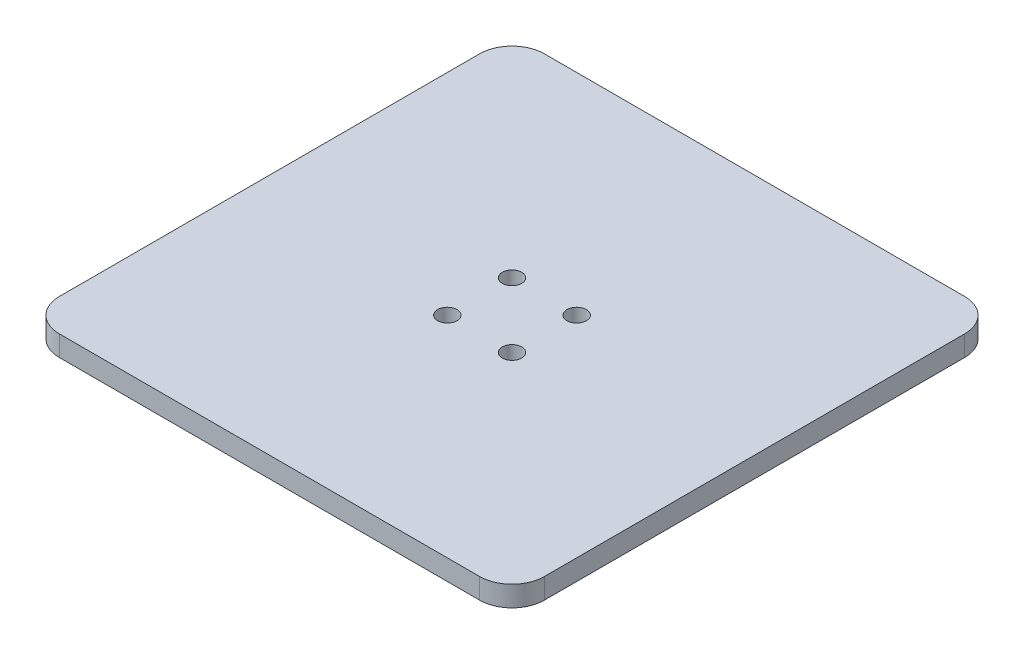
ISO-10303-21;
HEADER;
FILE_DESCRIPTION(('STEP AP214'),'2;1');
FILE_NAME('part.step','',(''),(''),'','','');
FILE_SCHEMA(('AUTOMOTIVE_DESIGN { 1 0 10303 214 1 1 1 1 }'));
ENDSEC;
DATA;
#1=APPLICATION_CONTEXT('core data for automotive mechanical design processes');
#2=APPLICATION_PROTOCOL_DEFINITION('international standard','automotive_design',2000,#1);
#3=PRODUCT_CONTEXT('',#1,'mechanical');
#4=PRODUCT('Part','Part','',(#3));
#5=PRODUCT_RELATED_PRODUCT_CATEGORY('part','',(#4));
#6=PRODUCT_DEFINITION_FORMATION('','',#4);
#7=PRODUCT_DEFINITION_CONTEXT('part definition',#1,'design');
#8=PRODUCT_DEFINITION('design','',#6,#7);
#9=PRODUCT_DEFINITION_SHAPE('','',#8);
#10=(LENGTH_UNIT() NAMED_UNIT(*) SI_UNIT(.MILLI.,.METRE.));
#11=(NAMED_UNIT(*) PLANE_ANGLE_UNIT() SI_UNIT($,.RADIAN.));
#12=(NAMED_UNIT(*) SI_UNIT($,.STERADIAN.) SOLID_ANGLE_UNIT());
#13=UNCERTAINTY_MEASURE_WITH_UNIT(LENGTH_MEASURE(1.E-05),#10,'distance_accuracy_value','');
#14=(GEOMETRIC_REPRESENTATION_CONTEXT(3) GLOBAL_UNCERTAINTY_ASSIGNED_CONTEXT((#13)) GLOBAL_UNIT_ASSIGNED_CONTEXT((#10,
#11,#12)) REPRESENTATION_CONTEXT('',''));
#15=CARTESIAN_POINT('',(0.,0.,0.));
#16=DIRECTION('',(0.,0.,1.));
#17=DIRECTION('',(1.,0.,0.));
#18=AXIS2_PLACEMENT_3D('',#15,#16,#17);
#19=CARTESIAN_POINT('',(0.,0.,0.));
#20=DIRECTION('',(0.,1.,0.));
#21=DIRECTION('',(0.,0.,1.));
#22=AXIS2_PLACEMENT_3D('',#19,#20,#21);
#23=PLANE('',#22);
#24=DIRECTION('',(-1.,0.,0.));
#25=VECTOR('',#24,1.);
#26=CARTESIAN_POINT('',(0.,0.,-150.));
#27=LINE('',#26,#25);
#28=CARTESIAN_POINT('',(-10.,0.,-150.));
#29=VERTEX_POINT('',#28);
#30=CARTESIAN_POINT('',(-140.,0.,-150.));
#31=VERTEX_POINT('',#30);
#32=EDGE_CURVE('E204',#29,#31,#27,.T.);
#33=ORIENTED_EDGE('',*,*,#32,.F.);
#34=CARTESIAN_POINT('',(-10.,0.,-140.));
#35=DIRECTION('',(0.,1.,0.));
#36=DIRECTION('',(0.,0.,1.));
#37=AXIS2_PLACEMENT_3D('',#34,#35,#36);
#38=CIRCLE('',#37,10.);
#39=CARTESIAN_POINT('',(0.,0.,-140.));
#40=VERTEX_POINT('',#39);
#41=EDGE_CURVE('E225',#29,#40,#38,.F.);
#42=ORIENTED_EDGE('',*,*,#41,.T.);
#43=DIRECTION('',(0.,0.,-1.));
#44=VECTOR('',#43,1.);
#45=CARTESIAN_POINT('',(0.,0.,0.));
#46=LINE('',#45,#44);
#47=CARTESIAN_POINT('',(0.,0.,-10.));
#48=VERTEX_POINT('',#47);
#49=EDGE_CURVE('E203',#48,#40,#46,.T.);
#50=ORIENTED_EDGE('',*,*,#49,.F.);
#51=CARTESIAN_POINT('',(-10.,0.,-10.));
#52=DIRECTION('',(0.,1.,0.));
#53=DIRECTION('',(0.,0.,1.));
#54=AXIS2_PLACEMENT_3D('',#51,#52,#53);
#55=CIRCLE('',#54,10.);
#56=CARTESIAN_POINT('',(-10.,0.,0.));
#57=VERTEX_POINT('',#56);
#58=EDGE_CURVE('E216',#48,#57,#55,.F.);
#59=ORIENTED_EDGE('',*,*,#58,.T.);
#60=DIRECTION('',(1.,0.,0.));
#61=VECTOR('',#60,1.);
#62=CARTESIAN_POINT('',(0.,0.,0.));
#63=LINE('',#62,#61);
#64=CARTESIAN_POINT('',(-140.,0.,0.));
#65=VERTEX_POINT('',#64);
#66=EDGE_CURVE('E193',#65,#57,#63,.T.);
#67=ORIENTED_EDGE('',*,*,#66,.F.);
#68=CARTESIAN_POINT('',(-140.,0.,-9.99999999999998));
#69=DIRECTION('',(0.,1.,0.));
#70=DIRECTION('',(0.,0.,1.));
#71=AXIS2_PLACEMENT_3D('',#68,#69,#70);
#72=CIRCLE('',#71,10.);
#73=CARTESIAN_POINT('',(-150.,0.,-9.99999999999998));
#74=VERTEX_POINT('',#73);
#75=EDGE_CURVE('E217',#65,#74,#72,.F.);
#76=ORIENTED_EDGE('',*,*,#75,.T.);
#77=DIRECTION('',(0.,0.,1.));
#78=VECTOR('',#77,1.);
#79=CARTESIAN_POINT('',(-150.,0.,0.));
#80=LINE('',#79,#78);
#81=CARTESIAN_POINT('',(-150.,0.,-140.));
#82=VERTEX_POINT('',#81);
#83=EDGE_CURVE('E210',#82,#74,#80,.T.);
#84=ORIENTED_EDGE('',*,*,#83,.F.);
#85=CARTESIAN_POINT('',(-140.,0.,-140.));
#86=DIRECTION('',(0.,1.,0.));
#87=DIRECTION('',(0.,0.,1.));
#88=AXIS2_PLACEMENT_3D('',#85,#86,#87);
#89=CIRCLE('',#88,10.);
#90=EDGE_CURVE('E219',#82,#31,#89,.F.);
#91=ORIENTED_EDGE('',*,*,#90,.T.);
#92=EDGE_LOOP('',(#33,#42,#50,#59,#67,#76,#84,#91));
#93=FACE_BOUND('',#92,.T.);
#94=DIRECTION('',(0.,0.,-1.));
#95=VECTOR('',#94,1.);
#96=CARTESIAN_POINT('',(-91.1,0.,-60.));
#97=LINE('',#96,#95);
#98=CARTESIAN_POINT('',(-91.1,0.,-60.));
#99=VERTEX_POINT('',#98);
#100=CARTESIAN_POINT('',(-91.1,0.,-90.));
#101=VERTEX_POINT('',#100);
#102=EDGE_CURVE('E64',#99,#101,#97,.T.);
#103=ORIENTED_EDGE('',*,*,#102,.F.);
#104=DIRECTION('',(-1.,0.,0.));
#105=VECTOR('',#104,1.);
#106=CARTESIAN_POINT('',(-91.1,0.,-60.));
#107=LINE('',#106,#105);
#108=CARTESIAN_POINT('',(-58.9,0.,-60.));
#109=VERTEX_POINT('',#108);
#110=EDGE_CURVE('E68',#109,#99,#107,.T.);
#111=ORIENTED_EDGE('',*,*,#110,.F.);
#112=DIRECTION('',(0.,0.,1.));
#113=VECTOR('',#112,1.);
#114=CARTESIAN_POINT('',(-58.9,0.,-60.));
#115=LINE('',#114,#113);
#116=CARTESIAN_POINT('',(-58.9,0.,-90.));
#117=VERTEX_POINT('',#116);
#118=EDGE_CURVE('E521',#117,#109,#115,.T.);
#119=ORIENTED_EDGE('',*,*,#118,.F.);
#120=DIRECTION('',(1.,0.,0.));
#121=VECTOR('',#120,1.);
#122=CARTESIAN_POINT('',(-91.1,0.,-90.));
#123=LINE('',#122,#121);
#124=EDGE_CURVE('E533',#101,#117,#123,.T.);
#125=ORIENTED_EDGE('',*,*,#124,.F.);
#126=EDGE_LOOP('',(#103,#111,#119,#125));
#127=FACE_BOUND('',#126,.T.);
#128=ADVANCED_FACE('F44',(#93,#127),#23,.F.);
#129=CARTESIAN_POINT('',(-85.,6.35,-85.));
#130=DIRECTION('',(0.,-1.,0.));
#131=DIRECTION('',(0.,0.,-1.));
#132=AXIS2_PLACEMENT_3D('',#129,#130,#131);
#133=CYLINDRICAL_SURFACE('',#132,1.25000000000001);
#134=CARTESIAN_POINT('',(-85.,2.05,-85.));
#135=DIRECTION('',(0.,1.,0.));
#136=DIRECTION('',(0.,0.,1.));
#137=AXIS2_PLACEMENT_3D('',#134,#135,#136);
#138=CIRCLE('',#137,1.25000000000001);
#139=CARTESIAN_POINT('',(-85.,2.05,-83.75));
#140=VERTEX_POINT('',#139);
#141=EDGE_CURVE('E47',#140,#140,#138,.T.);
#142=ORIENTED_EDGE('',*,*,#141,.T.);
#143=EDGE_LOOP('',(#142));
#144=FACE_BOUND('',#143,.T.);
#145=CARTESIAN_POINT('',(-85.,-9.,-85.));
#146=DIRECTION('',(0.,-1.,0.));
#147=DIRECTION('',(0.,0.,-1.));
#148=AXIS2_PLACEMENT_3D('',#145,#146,#147);
#149=CIRCLE('',#148,1.25000000000002);
#150=CARTESIAN_POINT('',(-85.,-9.,-86.25));
#151=VERTEX_POINT('',#150);
#152=EDGE_CURVE('E538',#151,#151,#149,.T.);
#153=ORIENTED_EDGE('',*,*,#152,.T.);
#154=EDGE_LOOP('',(#153));
#155=FACE_BOUND('',#154,.T.);
#156=ADVANCED_FACE('F255',(#144,#155),#133,.F.);
#157=CARTESIAN_POINT('',(-65.,6.35,-85.));
#158=DIRECTION('',(0.,-1.,0.));
#159=DIRECTION('',(0.,0.,-1.));
#160=AXIS2_PLACEMENT_3D('',#157,#158,#159);
#161=CYLINDRICAL_SURFACE('',#160,1.25000000000001);
#162=CARTESIAN_POINT('',(-65.,2.05,-85.));
#163=DIRECTION('',(0.,1.,0.));
#164=DIRECTION('',(0.,0.,1.));
#165=AXIS2_PLACEMENT_3D('',#162,#163,#164);
#166=CIRCLE('',#165,1.25000000000001);
#167=CARTESIAN_POINT('',(-65.,2.05,-83.75));
#168=VERTEX_POINT('',#167);
#169=EDGE_CURVE('E249',#168,#168,#166,.T.);
#170=ORIENTED_EDGE('',*,*,#169,.T.);
#171=EDGE_LOOP('',(#170));
#172=FACE_BOUND('',#171,.T.);
#173=CARTESIAN_POINT('',(-65.,-9.,-85.));
#174=DIRECTION('',(0.,-1.,0.));
#175=DIRECTION('',(0.,0.,-1.));
#176=AXIS2_PLACEMENT_3D('',#173,#174,#175);
#177=CIRCLE('',#176,1.25000000000001);
#178=CARTESIAN_POINT('',(-65.,-9.,-86.25));
#179=VERTEX_POINT('',#178);
#180=EDGE_CURVE('E541',#179,#179,#177,.T.);
#181=ORIENTED_EDGE('',*,*,#180,.T.);
#182=EDGE_LOOP('',(#181));
#183=FACE_BOUND('',#182,.T.);
#184=ADVANCED_FACE('F322',(#172,#183),#161,.F.);
#185=CARTESIAN_POINT('',(-85.,6.35,-65.));
#186=DIRECTION('',(0.,-1.,0.));
#187=DIRECTION('',(0.,0.,-1.));
#188=AXIS2_PLACEMENT_3D('',#185,#186,#187);
#189=CYLINDRICAL_SURFACE('',#188,1.25000000000001);
#190=CARTESIAN_POINT('',(-85.,2.05,-65.));
#191=DIRECTION('',(0.,1.,0.));
#192=DIRECTION('',(0.,0.,1.));
#193=AXIS2_PLACEMENT_3D('',#190,#191,#192);
#194=CIRCLE('',#193,1.25000000000001);
#195=CARTESIAN_POINT('',(-85.,2.05,-63.75));
#196=VERTEX_POINT('',#195);
#197=EDGE_CURVE('E241',#196,#196,#194,.T.);
#198=ORIENTED_EDGE('',*,*,#197,.T.);
#199=EDGE_LOOP('',(#198));
#200=FACE_BOUND('',#199,.T.);
#201=CARTESIAN_POINT('',(-85.,-9.,-65.));
#202=DIRECTION('',(0.,-1.,0.));
#203=DIRECTION('',(0.,0.,-1.));
#204=AXIS2_PLACEMENT_3D('',#201,#202,#203);
#205=CIRCLE('',#204,1.25000000000001);
#206=CARTESIAN_POINT('',(-85.,-9.,-66.25));
#207=VERTEX_POINT('',#206);
#208=EDGE_CURVE('E531',#207,#207,#205,.T.);
#209=ORIENTED_EDGE('',*,*,#208,.T.);
#210=EDGE_LOOP('',(#209));
#211=FACE_BOUND('',#210,.T.);
#212=ADVANCED_FACE('F451',(#200,#211),#189,.F.);
#213=CARTESIAN_POINT('',(-65.,6.35,-65.));
#214=DIRECTION('',(0.,-1.,0.));
#215=DIRECTION('',(0.,0.,-1.));
#216=AXIS2_PLACEMENT_3D('',#213,#214,#215);
#217=CYLINDRICAL_SURFACE('',#216,1.25000000000001);
#218=CARTESIAN_POINT('',(-65.,2.05,-65.));
#219=DIRECTION('',(0.,1.,0.));
#220=DIRECTION('',(0.,0.,1.));
#221=AXIS2_PLACEMENT_3D('',#218,#219,#220);
#222=CIRCLE('',#221,1.25000000000001);
#223=CARTESIAN_POINT('',(-65.,2.05,-63.75));
#224=VERTEX_POINT('',#223);
#225=EDGE_CURVE('E184',#224,#224,#222,.T.);
#226=ORIENTED_EDGE('',*,*,#225,.T.);
#227=EDGE_LOOP('',(#226));
#228=FACE_BOUND('',#227,.T.);
#229=CARTESIAN_POINT('',(-65.,-9.,-65.));
#230=DIRECTION('',(0.,-1.,0.));
#231=DIRECTION('',(0.,0.,-1.));
#232=AXIS2_PLACEMENT_3D('',#229,#230,#231);
#233=CIRCLE('',#232,1.25000000000001);
#234=CARTESIAN_POINT('',(-65.,-9.,-66.25));
#235=VERTEX_POINT('',#234);
#236=EDGE_CURVE('E542',#235,#235,#233,.T.);
#237=ORIENTED_EDGE('',*,*,#236,.T.);
#238=EDGE_LOOP('',(#237));
#239=FACE_BOUND('',#238,.T.);
#240=ADVANCED_FACE('F273',(#228,#239),#217,.F.);
#241=CARTESIAN_POINT('',(0.,6.35,0.));
#242=DIRECTION('',(0.,1.,0.));
#243=DIRECTION('',(0.,0.,1.));
#244=AXIS2_PLACEMENT_3D('',#241,#242,#243);
#245=PLANE('',#244);
#246=CARTESIAN_POINT('',(-65.,6.35,-85.));
#247=DIRECTION('',(0.,1.,0.));
#248=DIRECTION('',(0.,0.,1.));
#249=AXIS2_PLACEMENT_3D('',#246,#247,#248);
#250=CIRCLE('',#249,3.);
#251=CARTESIAN_POINT('',(-65.,6.35,-82.));
#252=VERTEX_POINT('',#251);
#253=EDGE_CURVE('E166',#252,#252,#250,.T.);
#254=ORIENTED_EDGE('',*,*,#253,.F.);
#255=EDGE_LOOP('',(#254));
#256=FACE_BOUND('',#255,.T.);
#257=CARTESIAN_POINT('',(-85.,6.35,-65.));
#258=DIRECTION('',(0.,1.,0.));
#259=DIRECTION('',(0.,0.,1.));
#260=AXIS2_PLACEMENT_3D('',#257,#258,#259);
#261=CIRCLE('',#260,3.00000000000001);
#262=CARTESIAN_POINT('',(-85.,6.35,-62.));
#263=VERTEX_POINT('',#262);
#264=EDGE_CURVE('E178',#263,#263,#261,.T.);
#265=ORIENTED_EDGE('',*,*,#264,.F.);
#266=EDGE_LOOP('',(#265));
#267=FACE_BOUND('',#266,.T.);
#268=CARTESIAN_POINT('',(-65.,6.35,-65.));
#269=DIRECTION('',(0.,1.,0.));
#270=DIRECTION('',(0.,0.,1.));
#271=AXIS2_PLACEMENT_3D('',#268,#269,#270);
#272=CIRCLE('',#271,3.);
#273=CARTESIAN_POINT('',(-65.,6.35,-62.));
#274=VERTEX_POINT('',#273);
#275=EDGE_CURVE('E159',#274,#274,#272,.T.);
#276=ORIENTED_EDGE('',*,*,#275,.F.);
#277=EDGE_LOOP('',(#276));
#278=FACE_BOUND('',#277,.T.);
#279=CARTESIAN_POINT('',(-85.,6.35,-85.));
#280=DIRECTION('',(0.,1.,0.));
#281=DIRECTION('',(0.,0.,1.));
#282=AXIS2_PLACEMENT_3D('',#279,#280,#281);
#283=CIRCLE('',#282,3.00000000000001);
#284=CARTESIAN_POINT('',(-85.,6.35,-82.));
#285=VERTEX_POINT('',#284);
#286=EDGE_CURVE('E174',#285,#285,#283,.T.);
#287=ORIENTED_EDGE('',*,*,#286,.F.);
#288=EDGE_LOOP('',(#287));
#289=FACE_BOUND('',#288,.T.);
#290=DIRECTION('',(0.,0.,-1.));
#291=VECTOR('',#290,1.);
#292=CARTESIAN_POINT('',(0.,6.35,0.));
#293=LINE('',#292,#291);
#294=CARTESIAN_POINT('',(0.,6.35,-10.));
#295=VERTEX_POINT('',#294);
#296=CARTESIAN_POINT('',(0.,6.35,-140.));
#297=VERTEX_POINT('',#296);
#298=EDGE_CURVE('E189',#295,#297,#293,.T.);
#299=ORIENTED_EDGE('',*,*,#298,.T.);
#300=CARTESIAN_POINT('',(-10.,6.35,-140.));
#301=DIRECTION('',(0.,1.,0.));
#302=DIRECTION('',(0.,0.,1.));
#303=AXIS2_PLACEMENT_3D('',#300,#301,#302);
#304=CIRCLE('',#303,10.);
#305=CARTESIAN_POINT('',(-10.,6.35,-150.));
#306=VERTEX_POINT('',#305);
#307=EDGE_CURVE('E231',#297,#306,#304,.T.);
#308=ORIENTED_EDGE('',*,*,#307,.T.);
#309=DIRECTION('',(-1.,0.,0.));
#310=VECTOR('',#309,1.);
#311=CARTESIAN_POINT('',(0.,6.35,-150.));
#312=LINE('',#311,#310);
#313=CARTESIAN_POINT('',(-140.,6.35,-150.));
#314=VERTEX_POINT('',#313);
#315=EDGE_CURVE('E186',#306,#314,#312,.T.);
#316=ORIENTED_EDGE('',*,*,#315,.T.);
#317=CARTESIAN_POINT('',(-140.,6.35,-140.));
#318=DIRECTION('',(0.,1.,0.));
#319=DIRECTION('',(0.,0.,1.));
#320=AXIS2_PLACEMENT_3D('',#317,#318,#319);
#321=CIRCLE('',#320,10.);
#322=CARTESIAN_POINT('',(-150.,6.35,-140.));
#323=VERTEX_POINT('',#322);
#324=EDGE_CURVE('E232',#314,#323,#321,.T.);
#325=ORIENTED_EDGE('',*,*,#324,.T.);
#326=DIRECTION('',(0.,0.,1.));
#327=VECTOR('',#326,1.);
#328=CARTESIAN_POINT('',(-150.,6.35,0.));
#329=LINE('',#328,#327);
#330=CARTESIAN_POINT('',(-150.,6.35,-9.99999999999998));
#331=VERTEX_POINT('',#330);
#332=EDGE_CURVE('E195',#323,#331,#329,.T.);
#333=ORIENTED_EDGE('',*,*,#332,.T.);
#334=CARTESIAN_POINT('',(-140.,6.35,-9.99999999999998));
#335=DIRECTION('',(0.,1.,0.));
#336=DIRECTION('',(0.,0.,1.));
#337=AXIS2_PLACEMENT_3D('',#334,#335,#336);
#338=CIRCLE('',#337,10.);
#339=CARTESIAN_POINT('',(-140.,6.35,0.));
#340=VERTEX_POINT('',#339);
#341=EDGE_CURVE('E233',#331,#340,#338,.T.);
#342=ORIENTED_EDGE('',*,*,#341,.T.);
#343=DIRECTION('',(1.,0.,0.));
#344=VECTOR('',#343,1.);
#345=CARTESIAN_POINT('',(0.,6.35,0.));
#346=LINE('',#345,#344);
#347=CARTESIAN_POINT('',(-10.,6.35,0.));
#348=VERTEX_POINT('',#347);
#349=EDGE_CURVE('E197',#340,#348,#346,.T.);
#350=ORIENTED_EDGE('',*,*,#349,.T.);
#351=CARTESIAN_POINT('',(-10.,6.35,-10.));
#352=DIRECTION('',(0.,1.,0.));
#353=DIRECTION('',(0.,0.,1.));
#354=AXIS2_PLACEMENT_3D('',#351,#352,#353);
#355=CIRCLE('',#354,10.);
#356=EDGE_CURVE('E230',#348,#295,#355,.T.);
#357=ORIENTED_EDGE('',*,*,#356,.T.);
#358=EDGE_LOOP('',(#299,#308,#316,#325,#333,#342,#350,#357));
#359=FACE_BOUND('',#358,.T.);
#360=ADVANCED_FACE('F269',(#256,#267,#278,#289,#359),#245,.T.);
#361=CARTESIAN_POINT('',(0.,6.35,0.));
#362=DIRECTION('',(-1.,0.,0.));
#363=DIRECTION('',(0.,0.,1.));
#364=AXIS2_PLACEMENT_3D('',#361,#362,#363);
#365=PLANE('',#364);
#366=ORIENTED_EDGE('',*,*,#49,.T.);
#367=DIRECTION('',(0.,-1.,0.));
#368=VECTOR('',#367,1.);
#369=CARTESIAN_POINT('',(0.,6.35,-140.));
#370=LINE('',#369,#368);
#371=EDGE_CURVE('E229',#40,#297,#370,.F.);
#372=ORIENTED_EDGE('',*,*,#371,.T.);
#373=ORIENTED_EDGE('',*,*,#298,.F.);
#374=DIRECTION('',(0.,-1.,0.));
#375=VECTOR('',#374,1.);
#376=CARTESIAN_POINT('',(0.,6.35,-10.));
#377=LINE('',#376,#375);
#378=EDGE_CURVE('E221',#295,#48,#377,.T.);
#379=ORIENTED_EDGE('',*,*,#378,.T.);
#380=EDGE_LOOP('',(#366,#372,#373,#379));
#381=FACE_BOUND('',#380,.T.);
#382=ADVANCED_FACE('F272',(#381),#365,.F.);
#383=CARTESIAN_POINT('',(0.,6.35,-150.));
#384=DIRECTION('',(0.,0.,1.));
#385=DIRECTION('',(1.,0.,0.));
#386=AXIS2_PLACEMENT_3D('',#383,#384,#385);
#387=PLANE('',#386);
#388=ORIENTED_EDGE('',*,*,#315,.F.);
#389=DIRECTION('',(0.,-1.,0.));
#390=VECTOR('',#389,1.);
#391=CARTESIAN_POINT('',(-10.,6.35,-150.));
#392=LINE('',#391,#390);
#393=EDGE_CURVE('E213',#306,#29,#392,.T.);
#394=ORIENTED_EDGE('',*,*,#393,.T.);
#395=ORIENTED_EDGE('',*,*,#32,.T.);
#396=DIRECTION('',(0.,-1.,0.));
#397=VECTOR('',#396,1.);
#398=CARTESIAN_POINT('',(-140.,6.35,-150.));
#399=LINE('',#398,#397);
#400=EDGE_CURVE('E199',#31,#314,#399,.F.);
#401=ORIENTED_EDGE('',*,*,#400,.T.);
#402=EDGE_LOOP('',(#388,#394,#395,#401));
#403=FACE_BOUND('',#402,.T.);
#404=ADVANCED_FACE('F290',(#403),#387,.F.);
#405=CARTESIAN_POINT('',(-150.,6.35,0.));
#406=DIRECTION('',(1.,0.,0.));
#407=DIRECTION('',(0.,0.,-1.));
#408=AXIS2_PLACEMENT_3D('',#405,#406,#407);
#409=PLANE('',#408);
#410=ORIENTED_EDGE('',*,*,#332,.F.);
#411=DIRECTION('',(0.,-1.,0.));
#412=VECTOR('',#411,1.);
#413=CARTESIAN_POINT('',(-150.,6.35,-140.));
#414=LINE('',#413,#412);
#415=EDGE_CURVE('E239',#323,#82,#414,.T.);
#416=ORIENTED_EDGE('',*,*,#415,.T.);
#417=ORIENTED_EDGE('',*,*,#83,.T.);
#418=DIRECTION('',(0.,-1.,0.));
#419=VECTOR('',#418,1.);
#420=CARTESIAN_POINT('',(-150.,6.35,-9.99999999999998));
#421=LINE('',#420,#419);
#422=EDGE_CURVE('E240',#74,#331,#421,.F.);
#423=ORIENTED_EDGE('',*,*,#422,.T.);
#424=EDGE_LOOP('',(#410,#416,#417,#423));
#425=FACE_BOUND('',#424,.T.);
#426=ADVANCED_FACE('F296',(#425),#409,.F.);
#427=CARTESIAN_POINT('',(0.,6.35,0.));
#428=DIRECTION('',(0.,0.,-1.));
#429=DIRECTION('',(-1.,0.,0.));
#430=AXIS2_PLACEMENT_3D('',#427,#428,#429);
#431=PLANE('',#430);
#432=ORIENTED_EDGE('',*,*,#349,.F.);
#433=DIRECTION('',(0.,-1.,0.));
#434=VECTOR('',#433,1.);
#435=CARTESIAN_POINT('',(-140.,6.35,0.));
#436=LINE('',#435,#434);
#437=EDGE_CURVE('E11',#340,#65,#436,.T.);
#438=ORIENTED_EDGE('',*,*,#437,.T.);
#439=ORIENTED_EDGE('',*,*,#66,.T.);
#440=DIRECTION('',(0.,-1.,0.));
#441=VECTOR('',#440,1.);
#442=CARTESIAN_POINT('',(-10.,6.35,0.));
#443=LINE('',#442,#441);
#444=EDGE_CURVE('E53',#57,#348,#443,.F.);
#445=ORIENTED_EDGE('',*,*,#444,.T.);
#446=EDGE_LOOP('',(#432,#438,#439,#445));
#447=FACE_BOUND('',#446,.T.);
#448=ADVANCED_FACE('F310',(#447),#431,.F.);
#449=CARTESIAN_POINT('',(-10.,6.35,-140.));
#450=DIRECTION('',(0.,-1.,0.));
#451=DIRECTION('',(0.,0.,-1.));
#452=AXIS2_PLACEMENT_3D('',#449,#450,#451);
#453=CYLINDRICAL_SURFACE('',#452,10.);
#454=ORIENTED_EDGE('',*,*,#307,.F.);
#455=ORIENTED_EDGE('',*,*,#371,.F.);
#456=ORIENTED_EDGE('',*,*,#41,.F.);
#457=ORIENTED_EDGE('',*,*,#393,.F.);
#458=EDGE_LOOP('',(#454,#455,#456,#457));
#459=FACE_BOUND('',#458,.T.);
#460=ADVANCED_FACE('F288',(#459),#453,.T.);
#461=CARTESIAN_POINT('',(-140.,6.35,-140.));
#462=DIRECTION('',(0.,-1.,0.));
#463=DIRECTION('',(0.,0.,-1.));
#464=AXIS2_PLACEMENT_3D('',#461,#462,#463);
#465=CYLINDRICAL_SURFACE('',#464,10.);
#466=ORIENTED_EDGE('',*,*,#324,.F.);
#467=ORIENTED_EDGE('',*,*,#400,.F.);
#468=ORIENTED_EDGE('',*,*,#90,.F.);
#469=ORIENTED_EDGE('',*,*,#415,.F.);
#470=EDGE_LOOP('',(#466,#467,#468,#469));
#471=FACE_BOUND('',#470,.T.);
#472=ADVANCED_FACE('F299',(#471),#465,.T.);
#473=CARTESIAN_POINT('',(-140.,6.35,-9.99999999999998));
#474=DIRECTION('',(0.,-1.,0.));
#475=DIRECTION('',(0.,0.,-1.));
#476=AXIS2_PLACEMENT_3D('',#473,#474,#475);
#477=CYLINDRICAL_SURFACE('',#476,10.);
#478=ORIENTED_EDGE('',*,*,#341,.F.);
#479=ORIENTED_EDGE('',*,*,#422,.F.);
#480=ORIENTED_EDGE('',*,*,#75,.F.);
#481=ORIENTED_EDGE('',*,*,#437,.F.);
#482=EDGE_LOOP('',(#478,#479,#480,#481));
#483=FACE_BOUND('',#482,.T.);
#484=ADVANCED_FACE('F308',(#483),#477,.T.);
#485=CARTESIAN_POINT('',(-10.,6.35,-10.));
#486=DIRECTION('',(0.,-1.,0.));
#487=DIRECTION('',(0.,0.,-1.));
#488=AXIS2_PLACEMENT_3D('',#485,#486,#487);
#489=CYLINDRICAL_SURFACE('',#488,10.);
#490=ORIENTED_EDGE('',*,*,#356,.F.);
#491=ORIENTED_EDGE('',*,*,#444,.F.);
#492=ORIENTED_EDGE('',*,*,#58,.F.);
#493=ORIENTED_EDGE('',*,*,#378,.F.);
#494=EDGE_LOOP('',(#490,#491,#492,#493));
#495=FACE_BOUND('',#494,.T.);
#496=ADVANCED_FACE('F50',(#495),#489,.T.);
#497=CARTESIAN_POINT('',(-65.,2.05,-65.));
#498=DIRECTION('',(0.,1.,0.));
#499=DIRECTION('',(0.,0.,1.));
#500=AXIS2_PLACEMENT_3D('',#497,#498,#499);
#501=CYLINDRICAL_SURFACE('',#500,3.);
#502=CARTESIAN_POINT('',(-65.,2.05,-65.));
#503=DIRECTION('',(0.,1.,0.));
#504=DIRECTION('',(0.,0.,1.));
#505=AXIS2_PLACEMENT_3D('',#502,#503,#504);
#506=CIRCLE('',#505,3.);
#507=CARTESIAN_POINT('',(-65.,2.05,-62.));
#508=VERTEX_POINT('',#507);
#509=EDGE_CURVE('E160',#508,#508,#506,.T.);
#510=CARTESIAN_POINT('',(-65.,2.05,-62.));
#511=CARTESIAN_POINT('',(-65.,2.09479166666667,-62.));
#512=CARTESIAN_POINT('',(-65.,2.13958333333333,-62.));
#513=CARTESIAN_POINT('',(-65.,2.22916666666667,-62.));
#514=CARTESIAN_POINT('',(-65.,2.27395833333333,-62.));
#515=CARTESIAN_POINT('',(-65.,2.36354166666667,-62.));
#516=CARTESIAN_POINT('',(-65.,2.40833333333333,-62.));
#517=CARTESIAN_POINT('',(-65.,2.49791666666667,-62.));
#518=CARTESIAN_POINT('',(-65.,2.54270833333333,-62.));
#519=CARTESIAN_POINT('',(-65.,2.63229166666667,-62.));
#520=CARTESIAN_POINT('',(-65.,2.67708333333333,-62.));
#521=CARTESIAN_POINT('',(-65.,2.76666666666667,-62.));
#522=CARTESIAN_POINT('',(-65.,2.81145833333333,-62.));
#523=CARTESIAN_POINT('',(-65.,2.90104166666667,-62.));
#524=CARTESIAN_POINT('',(-65.,2.94583333333333,-62.));
#525=CARTESIAN_POINT('',(-65.,3.03541666666667,-62.));
#526=CARTESIAN_POINT('',(-65.,3.08020833333333,-62.));
#527=CARTESIAN_POINT('',(-65.,3.16979166666667,-62.));
#528=CARTESIAN_POINT('',(-65.,3.21458333333333,-62.));
#529=CARTESIAN_POINT('',(-65.,3.30416666666667,-62.));
#530=CARTESIAN_POINT('',(-65.,3.34895833333333,-62.));
#531=CARTESIAN_POINT('',(-65.,3.43854166666667,-62.));
#532=CARTESIAN_POINT('',(-65.,3.48333333333333,-62.));
#533=CARTESIAN_POINT('',(-65.,3.57291666666667,-62.));
#534=CARTESIAN_POINT('',(-65.,3.61770833333333,-62.));
#535=CARTESIAN_POINT('',(-65.,3.70729166666667,-62.));
#536=CARTESIAN_POINT('',(-65.,3.75208333333333,-62.));
#537=CARTESIAN_POINT('',(-65.,3.84166666666667,-62.));
#538=CARTESIAN_POINT('',(-65.,3.88645833333333,-62.));
#539=CARTESIAN_POINT('',(-65.,3.97604166666667,-62.));
#540=CARTESIAN_POINT('',(-65.,4.02083333333333,-62.));
#541=CARTESIAN_POINT('',(-65.,4.11041666666667,-62.));
#542=CARTESIAN_POINT('',(-65.,4.15520833333333,-62.));
#543=CARTESIAN_POINT('',(-65.,4.24479166666667,-62.));
#544=CARTESIAN_POINT('',(-65.,4.28958333333333,-62.));
#545=CARTESIAN_POINT('',(-65.,4.37916666666667,-62.));
#546=CARTESIAN_POINT('',(-65.,4.42395833333333,-62.));
#547=CARTESIAN_POINT('',(-65.,4.51354166666667,-62.));
#548=CARTESIAN_POINT('',(-65.,4.55833333333333,-62.));
#549=CARTESIAN_POINT('',(-65.,4.64791666666667,-62.));
#550=CARTESIAN_POINT('',(-65.,4.69270833333333,-62.));
#551=CARTESIAN_POINT('',(-65.,4.78229166666667,-62.));
#552=CARTESIAN_POINT('',(-65.,4.82708333333333,-62.));
#553=CARTESIAN_POINT('',(-65.,4.91666666666667,-62.));
#554=CARTESIAN_POINT('',(-65.,4.96145833333333,-62.));
#555=CARTESIAN_POINT('',(-65.,5.05104166666667,-62.));
#556=CARTESIAN_POINT('',(-65.,5.09583333333333,-62.));
#557=CARTESIAN_POINT('',(-65.,5.18541666666667,-62.));
#558=CARTESIAN_POINT('',(-65.,5.23020833333333,-62.));
#559=CARTESIAN_POINT('',(-65.,5.31979166666667,-62.));
#560=CARTESIAN_POINT('',(-65.,5.36458333333333,-62.));
#561=CARTESIAN_POINT('',(-65.,5.45416666666667,-62.));
#562=CARTESIAN_POINT('',(-65.,5.49895833333333,-62.));
#563=CARTESIAN_POINT('',(-65.,5.58854166666667,-62.));
#564=CARTESIAN_POINT('',(-65.,5.63333333333333,-62.));
#565=CARTESIAN_POINT('',(-65.,5.72291666666667,-62.));
#566=CARTESIAN_POINT('',(-65.,5.76770833333333,-62.));
#567=CARTESIAN_POINT('',(-65.,5.85729166666667,-62.));
#568=CARTESIAN_POINT('',(-65.,5.90208333333333,-62.));
#569=CARTESIAN_POINT('',(-65.,5.99166666666667,-62.));
#570=CARTESIAN_POINT('',(-65.,6.03645833333333,-62.));
#571=CARTESIAN_POINT('',(-65.,6.12604166666667,-62.));
#572=CARTESIAN_POINT('',(-65.,6.17083333333333,-62.));
#573=CARTESIAN_POINT('',(-65.,6.26041666666667,-62.));
#574=CARTESIAN_POINT('',(-65.,6.30520833333333,-62.));
#575=CARTESIAN_POINT('',(-65.,6.35,-62.));
#576=B_SPLINE_CURVE_WITH_KNOTS('',3,(#510,#511,#512,#513,#514,#515,#516,#517,#518,#519,#520,
#521,#522,#523,#524,#525,#526,#527,#528,#529,#530,#531,#532,#533,#534,#535,#536,#537,#538,#539,
#540,#541,#542,#543,#544,#545,#546,#547,#548,#549,#550,#551,#552,#553,#554,#555,#556,#557,#558,
#559,#560,#561,#562,#563,#564,#565,#566,#567,#568,#569,#570,#571,#572,#573,#574,#575),
.UNSPECIFIED.,.F.,.F.,(4,2,2,2,2,2,2,2,2,2,2,2,2,2,2,2,2,2,2,2,2,2,2,2,2,2,2,2,2,2,2,2,4),(0.,
0.134375,0.26875,0.403125,0.5375,0.671875,0.80625,0.940625,1.075,1.209375,1.34375,1.478125,
1.6125,1.746875,1.88125,2.015625,2.15,2.284375,2.41875,2.553125,2.6875,2.821875,2.95625,
3.090625,3.225,3.359375,3.49375,3.628125,3.7625,3.896875,4.03125,4.165625,4.3),.UNSPECIFIED.);
#577=EDGE_CURVE('BSEAM365',#508,#274,#576,.T.);
#578=ORIENTED_EDGE('',*,*,#509,.F.);
#579=ORIENTED_EDGE('',*,*,#275,.T.);
#580=ORIENTED_EDGE('',*,*,#577,.T.);
#581=ORIENTED_EDGE('',*,*,#577,.F.);
#582=EDGE_LOOP('',(#578,#580,#579,#581));
#583=FACE_BOUND('',#582,.T.);
#584=ADVANCED_FACE('F365',(#583),#501,.F.);
#585=CARTESIAN_POINT('',(-65.,2.05,-65.));
#586=DIRECTION('',(0.,1.,0.));
#587=DIRECTION('',(0.,0.,1.));
#588=AXIS2_PLACEMENT_3D('',#585,#586,#587);
#589=PLANE('',#588);
#590=ORIENTED_EDGE('',*,*,#225,.F.);
#591=EDGE_LOOP('',(#590));
#592=FACE_BOUND('',#591,.T.);
#593=ORIENTED_EDGE('',*,*,#509,.T.);
#594=EDGE_LOOP('',(#593));
#595=FACE_BOUND('',#594,.T.);
#596=ADVANCED_FACE('F378',(#592,#595),#589,.T.);
#597=CARTESIAN_POINT('',(-85.,2.05,-65.));
#598=DIRECTION('',(0.,1.,0.));
#599=DIRECTION('',(0.,0.,1.));
#600=AXIS2_PLACEMENT_3D('',#597,#598,#599);
#601=CYLINDRICAL_SURFACE('',#600,3.00000000000001);
#602=CARTESIAN_POINT('',(-85.,2.05,-65.));
#603=DIRECTION('',(0.,1.,0.));
#604=DIRECTION('',(0.,0.,1.));
#605=AXIS2_PLACEMENT_3D('',#602,#603,#604);
#606=CIRCLE('',#605,3.00000000000001);
#607=CARTESIAN_POINT('',(-85.,2.05,-62.));
#608=VERTEX_POINT('',#607);
#609=EDGE_CURVE('E170',#608,#608,#606,.T.);
#610=CARTESIAN_POINT('',(-85.,2.05,-62.));
#611=CARTESIAN_POINT('',(-85.,2.09479166666667,-62.));
#612=CARTESIAN_POINT('',(-85.,2.13958333333333,-62.));
#613=CARTESIAN_POINT('',(-85.,2.22916666666667,-62.));
#614=CARTESIAN_POINT('',(-85.,2.27395833333333,-62.));
#615=CARTESIAN_POINT('',(-85.,2.36354166666667,-62.));
#616=CARTESIAN_POINT('',(-85.,2.40833333333333,-62.));
#617=CARTESIAN_POINT('',(-85.,2.49791666666667,-62.));
#618=CARTESIAN_POINT('',(-85.,2.54270833333333,-62.));
#619=CARTESIAN_POINT('',(-85.,2.63229166666667,-62.));
#620=CARTESIAN_POINT('',(-85.,2.67708333333333,-62.));
#621=CARTESIAN_POINT('',(-85.,2.76666666666667,-62.));
#622=CARTESIAN_POINT('',(-85.,2.81145833333333,-62.));
#623=CARTESIAN_POINT('',(-85.,2.90104166666667,-62.));
#624=CARTESIAN_POINT('',(-85.,2.94583333333333,-62.));
#625=CARTESIAN_POINT('',(-85.,3.03541666666667,-62.));
#626=CARTESIAN_POINT('',(-85.,3.08020833333333,-62.));
#627=CARTESIAN_POINT('',(-85.,3.16979166666667,-62.));
#628=CARTESIAN_POINT('',(-85.,3.21458333333333,-62.));
#629=CARTESIAN_POINT('',(-85.,3.30416666666667,-62.));
#630=CARTESIAN_POINT('',(-85.,3.34895833333333,-62.));
#631=CARTESIAN_POINT('',(-85.,3.43854166666667,-62.));
#632=CARTESIAN_POINT('',(-85.,3.48333333333333,-62.));
#633=CARTESIAN_POINT('',(-85.,3.57291666666667,-62.));
#634=CARTESIAN_POINT('',(-85.,3.61770833333333,-62.));
#635=CARTESIAN_POINT('',(-85.,3.70729166666667,-62.));
#636=CARTESIAN_POINT('',(-85.,3.75208333333333,-62.));
#637=CARTESIAN_POINT('',(-85.,3.84166666666667,-62.));
#638=CARTESIAN_POINT('',(-85.,3.88645833333333,-62.));
#639=CARTESIAN_POINT('',(-85.,3.97604166666667,-62.));
#640=CARTESIAN_POINT('',(-85.,4.02083333333333,-62.));
#641=CARTESIAN_POINT('',(-85.,4.11041666666667,-62.));
#642=CARTESIAN_POINT('',(-85.,4.15520833333333,-62.));
#643=CARTESIAN_POINT('',(-85.,4.24479166666667,-62.));
#644=CARTESIAN_POINT('',(-85.,4.28958333333333,-62.));
#645=CARTESIAN_POINT('',(-85.,4.37916666666667,-62.));
#646=CARTESIAN_POINT('',(-85.,4.42395833333333,-62.));
#647=CARTESIAN_POINT('',(-85.,4.51354166666667,-62.));
#648=CARTESIAN_POINT('',(-85.,4.55833333333333,-62.));
#649=CARTESIAN_POINT('',(-85.,4.64791666666667,-62.));
#650=CARTESIAN_POINT('',(-85.,4.69270833333333,-62.));
#651=CARTESIAN_POINT('',(-85.,4.78229166666667,-62.));
#652=CARTESIAN_POINT('',(-85.,4.82708333333333,-62.));
#653=CARTESIAN_POINT('',(-85.,4.91666666666667,-62.));
#654=CARTESIAN_POINT('',(-85.,4.96145833333333,-62.));
#655=CARTESIAN_POINT('',(-85.,5.05104166666667,-62.));
#656=CARTESIAN_POINT('',(-85.,5.09583333333333,-62.));
#657=CARTESIAN_POINT('',(-85.,5.18541666666667,-62.));
#658=CARTESIAN_POINT('',(-85.,5.23020833333333,-62.));
#659=CARTESIAN_POINT('',(-85.,5.31979166666667,-62.));
#660=CARTESIAN_POINT('',(-85.,5.36458333333333,-62.));
#661=CARTESIAN_POINT('',(-85.,5.45416666666667,-62.));
#662=CARTESIAN_POINT('',(-85.,5.49895833333333,-62.));
#663=CARTESIAN_POINT('',(-85.,5.58854166666667,-62.));
#664=CARTESIAN_POINT('',(-85.,5.63333333333333,-62.));
#665=CARTESIAN_POINT('',(-85.,5.72291666666667,-62.));
#666=CARTESIAN_POINT('',(-85.,5.76770833333333,-62.));
#667=CARTESIAN_POINT('',(-85.,5.85729166666667,-62.));
#668=CARTESIAN_POINT('',(-85.,5.90208333333333,-62.));
#669=CARTESIAN_POINT('',(-85.,5.99166666666667,-62.));
#670=CARTESIAN_POINT('',(-85.,6.03645833333333,-62.));
#671=CARTESIAN_POINT('',(-85.,6.12604166666667,-62.));
#672=CARTESIAN_POINT('',(-85.,6.17083333333333,-62.));
#673=CARTESIAN_POINT('',(-85.,6.26041666666667,-62.));
#674=CARTESIAN_POINT('',(-85.,6.30520833333333,-62.));
#675=CARTESIAN_POINT('',(-85.,6.35,-62.));
#676=B_SPLINE_CURVE_WITH_KNOTS('',3,(#610,#611,#612,#613,#614,#615,#616,#617,#618,#619,#620,
#621,#622,#623,#624,#625,#626,#627,#628,#629,#630,#631,#632,#633,#634,#635,#636,#637,#638,#639,
#640,#641,#642,#643,#644,#645,#646,#647,#648,#649,#650,#651,#652,#653,#654,#655,#656,#657,#658,
#659,#660,#661,#662,#663,#664,#665,#666,#667,#668,#669,#670,#671,#672,#673,#674,#675),
.UNSPECIFIED.,.F.,.F.,(4,2,2,2,2,2,2,2,2,2,2,2,2,2,2,2,2,2,2,2,2,2,2,2,2,2,2,2,2,2,2,2,4),(0.,
0.134375,0.26875,0.403125,0.5375,0.671875,0.80625,0.940625,1.075,1.209375,1.34375,1.478125,
1.6125,1.746875,1.88125,2.015625,2.15,2.284375,2.41875,2.553125,2.6875,2.821875,2.95625,
3.090625,3.225,3.359375,3.49375,3.628125,3.7625,3.896875,4.03125,4.165625,4.3),.UNSPECIFIED.);
#677=EDGE_CURVE('BSEAM389',#608,#263,#676,.T.);
#678=ORIENTED_EDGE('',*,*,#609,.F.);
#679=ORIENTED_EDGE('',*,*,#264,.T.);
#680=ORIENTED_EDGE('',*,*,#677,.T.);
#681=ORIENTED_EDGE('',*,*,#677,.F.);
#682=EDGE_LOOP('',(#678,#680,#679,#681));
#683=FACE_BOUND('',#682,.T.);
#684=ADVANCED_FACE('F389',(#683),#601,.F.);
#685=CARTESIAN_POINT('',(-85.,2.05,-65.));
#686=DIRECTION('',(0.,1.,0.));
#687=DIRECTION('',(0.,0.,1.));
#688=AXIS2_PLACEMENT_3D('',#685,#686,#687);
#689=PLANE('',#688);
#690=ORIENTED_EDGE('',*,*,#197,.F.);
#691=EDGE_LOOP('',(#690));
#692=FACE_BOUND('',#691,.T.);
#693=ORIENTED_EDGE('',*,*,#609,.T.);
#694=EDGE_LOOP('',(#693));
#695=FACE_BOUND('',#694,.T.);
#696=ADVANCED_FACE('F399',(#692,#695),#689,.T.);
#697=CARTESIAN_POINT('',(-65.,2.05,-85.));
#698=DIRECTION('',(0.,1.,0.));
#699=DIRECTION('',(0.,0.,1.));
#700=AXIS2_PLACEMENT_3D('',#697,#698,#699);
#701=CYLINDRICAL_SURFACE('',#700,3.);
#702=CARTESIAN_POINT('',(-65.,2.05,-85.));
#703=DIRECTION('',(0.,1.,0.));
#704=DIRECTION('',(0.,0.,1.));
#705=AXIS2_PLACEMENT_3D('',#702,#703,#704);
#706=CIRCLE('',#705,3.);
#707=CARTESIAN_POINT('',(-65.,2.05,-82.));
#708=VERTEX_POINT('',#707);
#709=EDGE_CURVE('E172',#708,#708,#706,.T.);
#710=CARTESIAN_POINT('',(-65.,2.05,-82.));
#711=CARTESIAN_POINT('',(-65.,2.09479166666667,-82.));
#712=CARTESIAN_POINT('',(-65.,2.13958333333333,-82.));
#713=CARTESIAN_POINT('',(-65.,2.22916666666667,-82.));
#714=CARTESIAN_POINT('',(-65.,2.27395833333333,-82.));
#715=CARTESIAN_POINT('',(-65.,2.36354166666667,-82.));
#716=CARTESIAN_POINT('',(-65.,2.40833333333333,-82.));
#717=CARTESIAN_POINT('',(-65.,2.49791666666667,-82.));
#718=CARTESIAN_POINT('',(-65.,2.54270833333333,-82.));
#719=CARTESIAN_POINT('',(-65.,2.63229166666667,-82.));
#720=CARTESIAN_POINT('',(-65.,2.67708333333333,-82.));
#721=CARTESIAN_POINT('',(-65.,2.76666666666667,-82.));
#722=CARTESIAN_POINT('',(-65.,2.81145833333333,-82.));
#723=CARTESIAN_POINT('',(-65.,2.90104166666667,-82.));
#724=CARTESIAN_POINT('',(-65.,2.94583333333333,-82.));
#725=CARTESIAN_POINT('',(-65.,3.03541666666667,-82.));
#726=CARTESIAN_POINT('',(-65.,3.08020833333333,-82.));
#727=CARTESIAN_POINT('',(-65.,3.16979166666667,-82.));
#728=CARTESIAN_POINT('',(-65.,3.21458333333333,-82.));
#729=CARTESIAN_POINT('',(-65.,3.30416666666667,-82.));
#730=CARTESIAN_POINT('',(-65.,3.34895833333333,-82.));
#731=CARTESIAN_POINT('',(-65.,3.43854166666667,-82.));
#732=CARTESIAN_POINT('',(-65.,3.48333333333333,-82.));
#733=CARTESIAN_POINT('',(-65.,3.57291666666667,-82.));
#734=CARTESIAN_POINT('',(-65.,3.61770833333333,-82.));
#735=CARTESIAN_POINT('',(-65.,3.70729166666667,-82.));
#736=CARTESIAN_POINT('',(-65.,3.75208333333333,-82.));
#737=CARTESIAN_POINT('',(-65.,3.84166666666667,-82.));
#738=CARTESIAN_POINT('',(-65.,3.88645833333333,-82.));
#739=CARTESIAN_POINT('',(-65.,3.97604166666667,-82.));
#740=CARTESIAN_POINT('',(-65.,4.02083333333333,-82.));
#741=CARTESIAN_POINT('',(-65.,4.11041666666667,-82.));
#742=CARTESIAN_POINT('',(-65.,4.15520833333333,-82.));
#743=CARTESIAN_POINT('',(-65.,4.24479166666667,-82.));
#744=CARTESIAN_POINT('',(-65.,4.28958333333333,-82.));
#745=CARTESIAN_POINT('',(-65.,4.37916666666667,-82.));
#746=CARTESIAN_POINT('',(-65.,4.42395833333333,-82.));
#747=CARTESIAN_POINT('',(-65.,4.51354166666667,-82.));
#748=CARTESIAN_POINT('',(-65.,4.55833333333333,-82.));
#749=CARTESIAN_POINT('',(-65.,4.64791666666667,-82.));
#750=CARTESIAN_POINT('',(-65.,4.69270833333333,-82.));
#751=CARTESIAN_POINT('',(-65.,4.78229166666667,-82.));
#752=CARTESIAN_POINT('',(-65.,4.82708333333333,-82.));
#753=CARTESIAN_POINT('',(-65.,4.91666666666667,-82.));
#754=CARTESIAN_POINT('',(-65.,4.96145833333333,-82.));
#755=CARTESIAN_POINT('',(-65.,5.05104166666667,-82.));
#756=CARTESIAN_POINT('',(-65.,5.09583333333333,-82.));
#757=CARTESIAN_POINT('',(-65.,5.18541666666667,-82.));
#758=CARTESIAN_POINT('',(-65.,5.23020833333333,-82.));
#759=CARTESIAN_POINT('',(-65.,5.31979166666667,-82.));
#760=CARTESIAN_POINT('',(-65.,5.36458333333333,-82.));
#761=CARTESIAN_POINT('',(-65.,5.45416666666667,-82.));
#762=CARTESIAN_POINT('',(-65.,5.49895833333333,-82.));
#763=CARTESIAN_POINT('',(-65.,5.58854166666667,-82.));
#764=CARTESIAN_POINT('',(-65.,5.63333333333333,-82.));
#765=CARTESIAN_POINT('',(-65.,5.72291666666667,-82.));
#766=CARTESIAN_POINT('',(-65.,5.76770833333333,-82.));
#767=CARTESIAN_POINT('',(-65.,5.85729166666667,-82.));
#768=CARTESIAN_POINT('',(-65.,5.90208333333333,-82.));
#769=CARTESIAN_POINT('',(-65.,5.99166666666667,-82.));
#770=CARTESIAN_POINT('',(-65.,6.03645833333333,-82.));
#771=CARTESIAN_POINT('',(-65.,6.12604166666667,-82.));
#772=CARTESIAN_POINT('',(-65.,6.17083333333333,-82.));
#773=CARTESIAN_POINT('',(-65.,6.26041666666667,-82.));
#774=CARTESIAN_POINT('',(-65.,6.30520833333333,-82.));
#775=CARTESIAN_POINT('',(-65.,6.35,-82.));
#776=B_SPLINE_CURVE_WITH_KNOTS('',3,(#710,#711,#712,#713,#714,#715,#716,#717,#718,#719,#720,
#721,#722,#723,#724,#725,#726,#727,#728,#729,#730,#731,#732,#733,#734,#735,#736,#737,#738,#739,
#740,#741,#742,#743,#744,#745,#746,#747,#748,#749,#750,#751,#752,#753,#754,#755,#756,#757,#758,
#759,#760,#761,#762,#763,#764,#765,#766,#767,#768,#769,#770,#771,#772,#773,#774,#775),
.UNSPECIFIED.,.F.,.F.,(4,2,2,2,2,2,2,2,2,2,2,2,2,2,2,2,2,2,2,2,2,2,2,2,2,2,2,2,2,2,2,2,4),(0.,
0.134375,0.26875,0.403125,0.5375,0.671875,0.80625,0.940625,1.075,1.209375,1.34375,1.478125,
1.6125,1.746875,1.88125,2.015625,2.15,2.284375,2.41875,2.553125,2.6875,2.821875,2.95625,
3.090625,3.225,3.359375,3.49375,3.628125,3.7625,3.896875,4.03125,4.165625,4.3),.UNSPECIFIED.);
#777=EDGE_CURVE('BSEAM408',#708,#252,#776,.T.);
#778=ORIENTED_EDGE('',*,*,#709,.F.);
#779=ORIENTED_EDGE('',*,*,#253,.T.);
#780=ORIENTED_EDGE('',*,*,#777,.T.);
#781=ORIENTED_EDGE('',*,*,#777,.F.);
#782=EDGE_LOOP('',(#778,#780,#779,#781));
#783=FACE_BOUND('',#782,.T.);
#784=ADVANCED_FACE('F408',(#783),#701,.F.);
#785=CARTESIAN_POINT('',(-65.,2.05,-85.));
#786=DIRECTION('',(0.,1.,0.));
#787=DIRECTION('',(0.,0.,1.));
#788=AXIS2_PLACEMENT_3D('',#785,#786,#787);
#789=PLANE('',#788);
#790=ORIENTED_EDGE('',*,*,#169,.F.);
#791=EDGE_LOOP('',(#790));
#792=FACE_BOUND('',#791,.T.);
#793=ORIENTED_EDGE('',*,*,#709,.T.);
#794=EDGE_LOOP('',(#793));
#795=FACE_BOUND('',#794,.T.);
#796=ADVANCED_FACE('F266',(#792,#795),#789,.T.);
#797=CARTESIAN_POINT('',(-85.,2.05,-85.));
#798=DIRECTION('',(0.,1.,0.));
#799=DIRECTION('',(0.,0.,1.));
#800=AXIS2_PLACEMENT_3D('',#797,#798,#799);
#801=CYLINDRICAL_SURFACE('',#800,3.00000000000001);
#802=CARTESIAN_POINT('',(-85.,2.05,-85.));
#803=DIRECTION('',(0.,1.,0.));
#804=DIRECTION('',(0.,0.,1.));
#805=AXIS2_PLACEMENT_3D('',#802,#803,#804);
#806=CIRCLE('',#805,3.00000000000001);
#807=CARTESIAN_POINT('',(-85.,2.05,-82.));
#808=VERTEX_POINT('',#807);
#809=EDGE_CURVE('E182',#808,#808,#806,.T.);
#810=CARTESIAN_POINT('',(-85.,2.05,-82.));
#811=CARTESIAN_POINT('',(-85.,2.09479166666667,-82.));
#812=CARTESIAN_POINT('',(-85.,2.13958333333333,-82.));
#813=CARTESIAN_POINT('',(-85.,2.22916666666667,-82.));
#814=CARTESIAN_POINT('',(-85.,2.27395833333333,-82.));
#815=CARTESIAN_POINT('',(-85.,2.36354166666667,-82.));
#816=CARTESIAN_POINT('',(-85.,2.40833333333333,-82.));
#817=CARTESIAN_POINT('',(-85.,2.49791666666667,-82.));
#818=CARTESIAN_POINT('',(-85.,2.54270833333333,-82.));
#819=CARTESIAN_POINT('',(-85.,2.63229166666667,-82.));
#820=CARTESIAN_POINT('',(-85.,2.67708333333333,-82.));
#821=CARTESIAN_POINT('',(-85.,2.76666666666667,-82.));
#822=CARTESIAN_POINT('',(-85.,2.81145833333333,-82.));
#823=CARTESIAN_POINT('',(-85.,2.90104166666667,-82.));
#824=CARTESIAN_POINT('',(-85.,2.94583333333333,-82.));
#825=CARTESIAN_POINT('',(-85.,3.03541666666667,-82.));
#826=CARTESIAN_POINT('',(-85.,3.08020833333333,-82.));
#827=CARTESIAN_POINT('',(-85.,3.16979166666667,-82.));
#828=CARTESIAN_POINT('',(-85.,3.21458333333333,-82.));
#829=CARTESIAN_POINT('',(-85.,3.30416666666667,-82.));
#830=CARTESIAN_POINT('',(-85.,3.34895833333333,-82.));
#831=CARTESIAN_POINT('',(-85.,3.43854166666667,-82.));
#832=CARTESIAN_POINT('',(-85.,3.48333333333333,-82.));
#833=CARTESIAN_POINT('',(-85.,3.57291666666667,-82.));
#834=CARTESIAN_POINT('',(-85.,3.61770833333333,-82.));
#835=CARTESIAN_POINT('',(-85.,3.70729166666667,-82.));
#836=CARTESIAN_POINT('',(-85.,3.75208333333333,-82.));
#837=CARTESIAN_POINT('',(-85.,3.84166666666667,-82.));
#838=CARTESIAN_POINT('',(-85.,3.88645833333333,-82.));
#839=CARTESIAN_POINT('',(-85.,3.97604166666667,-82.));
#840=CARTESIAN_POINT('',(-85.,4.02083333333333,-82.));
#841=CARTESIAN_POINT('',(-85.,4.11041666666667,-82.));
#842=CARTESIAN_POINT('',(-85.,4.15520833333333,-82.));
#843=CARTESIAN_POINT('',(-85.,4.24479166666667,-82.));
#844=CARTESIAN_POINT('',(-85.,4.28958333333333,-82.));
#845=CARTESIAN_POINT('',(-85.,4.37916666666667,-82.));
#846=CARTESIAN_POINT('',(-85.,4.42395833333333,-82.));
#847=CARTESIAN_POINT('',(-85.,4.51354166666667,-82.));
#848=CARTESIAN_POINT('',(-85.,4.55833333333333,-82.));
#849=CARTESIAN_POINT('',(-85.,4.64791666666667,-82.));
#850=CARTESIAN_POINT('',(-85.,4.69270833333333,-82.));
#851=CARTESIAN_POINT('',(-85.,4.78229166666667,-82.));
#852=CARTESIAN_POINT('',(-85.,4.82708333333333,-82.));
#853=CARTESIAN_POINT('',(-85.,4.91666666666667,-82.));
#854=CARTESIAN_POINT('',(-85.,4.96145833333333,-82.));
#855=CARTESIAN_POINT('',(-85.,5.05104166666667,-82.));
#856=CARTESIAN_POINT('',(-85.,5.09583333333333,-82.));
#857=CARTESIAN_POINT('',(-85.,5.18541666666667,-82.));
#858=CARTESIAN_POINT('',(-85.,5.23020833333333,-82.));
#859=CARTESIAN_POINT('',(-85.,5.31979166666667,-82.));
#860=CARTESIAN_POINT('',(-85.,5.36458333333333,-82.));
#861=CARTESIAN_POINT('',(-85.,5.45416666666667,-82.));
#862=CARTESIAN_POINT('',(-85.,5.49895833333333,-82.));
#863=CARTESIAN_POINT('',(-85.,5.58854166666667,-82.));
#864=CARTESIAN_POINT('',(-85.,5.63333333333333,-82.));
#865=CARTESIAN_POINT('',(-85.,5.72291666666667,-82.));
#866=CARTESIAN_POINT('',(-85.,5.76770833333333,-82.));
#867=CARTESIAN_POINT('',(-85.,5.85729166666667,-82.));
#868=CARTESIAN_POINT('',(-85.,5.90208333333333,-82.));
#869=CARTESIAN_POINT('',(-85.,5.99166666666667,-82.));
#870=CARTESIAN_POINT('',(-85.,6.03645833333333,-82.));
#871=CARTESIAN_POINT('',(-85.,6.12604166666667,-82.));
#872=CARTESIAN_POINT('',(-85.,6.17083333333333,-82.));
#873=CARTESIAN_POINT('',(-85.,6.26041666666667,-82.));
#874=CARTESIAN_POINT('',(-85.,6.30520833333333,-82.));
#875=CARTESIAN_POINT('',(-85.,6.35,-82.));
#876=B_SPLINE_CURVE_WITH_KNOTS('',3,(#810,#811,#812,#813,#814,#815,#816,#817,#818,#819,#820,
#821,#822,#823,#824,#825,#826,#827,#828,#829,#830,#831,#832,#833,#834,#835,#836,#837,#838,#839,
#840,#841,#842,#843,#844,#845,#846,#847,#848,#849,#850,#851,#852,#853,#854,#855,#856,#857,#858,
#859,#860,#861,#862,#863,#864,#865,#866,#867,#868,#869,#870,#871,#872,#873,#874,#875),
.UNSPECIFIED.,.F.,.F.,(4,2,2,2,2,2,2,2,2,2,2,2,2,2,2,2,2,2,2,2,2,2,2,2,2,2,2,2,2,2,2,2,4),(0.,
0.134375,0.26875,0.403125,0.5375,0.671875,0.80625,0.940625,1.075,1.209375,1.34375,1.478125,
1.6125,1.746875,1.88125,2.015625,2.15,2.284375,2.41875,2.553125,2.6875,2.821875,2.95625,
3.090625,3.225,3.359375,3.49375,3.628125,3.7625,3.896875,4.03125,4.165625,4.3),.UNSPECIFIED.);
#877=EDGE_CURVE('BSEAM257',#808,#285,#876,.T.);
#878=ORIENTED_EDGE('',*,*,#809,.F.);
#879=ORIENTED_EDGE('',*,*,#286,.T.);
#880=ORIENTED_EDGE('',*,*,#877,.T.);
#881=ORIENTED_EDGE('',*,*,#877,.F.);
#882=EDGE_LOOP('',(#878,#880,#879,#881));
#883=FACE_BOUND('',#882,.T.);
#884=ADVANCED_FACE('F257',(#883),#801,.F.);
#885=CARTESIAN_POINT('',(-85.,2.05,-85.));
#886=DIRECTION('',(0.,1.,0.));
#887=DIRECTION('',(0.,0.,1.));
#888=AXIS2_PLACEMENT_3D('',#885,#886,#887);
#889=PLANE('',#888);
#890=ORIENTED_EDGE('',*,*,#141,.F.);
#891=EDGE_LOOP('',(#890));
#892=FACE_BOUND('',#891,.T.);
#893=ORIENTED_EDGE('',*,*,#809,.T.);
#894=EDGE_LOOP('',(#893));
#895=FACE_BOUND('',#894,.T.);
#896=ADVANCED_FACE('F260',(#892,#895),#889,.T.);
#897=CARTESIAN_POINT('',(0.,-9.,0.));
#898=DIRECTION('',(0.,-1.,0.));
#899=DIRECTION('',(0.,0.,-1.));
#900=AXIS2_PLACEMENT_3D('',#897,#898,#899);
#901=PLANE('',#900);
#902=ORIENTED_EDGE('',*,*,#180,.F.);
#903=EDGE_LOOP('',(#902));
#904=FACE_BOUND('',#903,.T.);
#905=ORIENTED_EDGE('',*,*,#208,.F.);
#906=EDGE_LOOP('',(#905));
#907=FACE_BOUND('',#906,.T.);
#908=DIRECTION('',(0.,0.,-1.));
#909=VECTOR('',#908,1.);
#910=CARTESIAN_POINT('',(-91.1,-9.,-60.));
#911=LINE('',#910,#909);
#912=CARTESIAN_POINT('',(-91.1,-9.,-60.));
#913=VERTEX_POINT('',#912);
#914=CARTESIAN_POINT('',(-91.1,-9.,-90.));
#915=VERTEX_POINT('',#914);
#916=EDGE_CURVE('E144',#913,#915,#911,.T.);
#917=ORIENTED_EDGE('',*,*,#916,.T.);
#918=DIRECTION('',(1.,0.,0.));
#919=VECTOR('',#918,1.);
#920=CARTESIAN_POINT('',(-91.1,-9.,-90.));
#921=LINE('',#920,#919);
#922=CARTESIAN_POINT('',(-58.9,-9.,-90.));
#923=VERTEX_POINT('',#922);
#924=EDGE_CURVE('E135',#915,#923,#921,.T.);
#925=ORIENTED_EDGE('',*,*,#924,.T.);
#926=DIRECTION('',(0.,0.,1.));
#927=VECTOR('',#926,1.);
#928=CARTESIAN_POINT('',(-58.9,-9.,-60.));
#929=LINE('',#928,#927);
#930=CARTESIAN_POINT('',(-58.9,-9.,-60.));
#931=VERTEX_POINT('',#930);
#932=EDGE_CURVE('E145',#923,#931,#929,.T.);
#933=ORIENTED_EDGE('',*,*,#932,.T.);
#934=DIRECTION('',(-1.,0.,0.));
#935=VECTOR('',#934,1.);
#936=CARTESIAN_POINT('',(-91.1,-9.,-60.));
#937=LINE('',#936,#935);
#938=EDGE_CURVE('E151',#931,#913,#937,.T.);
#939=ORIENTED_EDGE('',*,*,#938,.T.);
#940=EDGE_LOOP('',(#917,#925,#933,#939));
#941=FACE_BOUND('',#940,.T.);
#942=ORIENTED_EDGE('',*,*,#152,.F.);
#943=EDGE_LOOP('',(#942));
#944=FACE_BOUND('',#943,.T.);
#945=ORIENTED_EDGE('',*,*,#236,.F.);
#946=EDGE_LOOP('',(#945));
#947=FACE_BOUND('',#946,.T.);
#948=ADVANCED_FACE('F146',(#904,#907,#941,#944,#947),#901,.T.);
#949=CARTESIAN_POINT('',(-91.1,-9.,-60.));
#950=DIRECTION('',(1.,0.,0.));
#951=DIRECTION('',(0.,0.,-1.));
#952=AXIS2_PLACEMENT_3D('',#949,#950,#951);
#953=PLANE('',#952);
#954=ORIENTED_EDGE('',*,*,#102,.T.);
#955=DIRECTION('',(0.,1.,0.));
#956=VECTOR('',#955,1.);
#957=CARTESIAN_POINT('',(-91.1,-9.,-90.));
#958=LINE('',#957,#956);
#959=EDGE_CURVE('E140',#915,#101,#958,.T.);
#960=ORIENTED_EDGE('',*,*,#959,.F.);
#961=ORIENTED_EDGE('',*,*,#916,.F.);
#962=DIRECTION('',(0.,1.,0.));
#963=VECTOR('',#962,1.);
#964=CARTESIAN_POINT('',(-91.1,-9.,-60.));
#965=LINE('',#964,#963);
#966=EDGE_CURVE('E522',#913,#99,#965,.T.);
#967=ORIENTED_EDGE('',*,*,#966,.T.);
#968=EDGE_LOOP('',(#954,#960,#961,#967));
#969=FACE_BOUND('',#968,.T.);
#970=ADVANCED_FACE('F156',(#969),#953,.F.);
#971=CARTESIAN_POINT('',(-91.1,-9.,-90.));
#972=DIRECTION('',(0.,0.,1.));
#973=DIRECTION('',(1.,0.,0.));
#974=AXIS2_PLACEMENT_3D('',#971,#972,#973);
#975=PLANE('',#974);
#976=ORIENTED_EDGE('',*,*,#124,.T.);
#977=DIRECTION('',(0.,1.,0.));
#978=VECTOR('',#977,1.);
#979=CARTESIAN_POINT('',(-58.9,-9.,-90.));
#980=LINE('',#979,#978);
#981=EDGE_CURVE('E143',#923,#117,#980,.T.);
#982=ORIENTED_EDGE('',*,*,#981,.F.);
#983=ORIENTED_EDGE('',*,*,#924,.F.);
#984=ORIENTED_EDGE('',*,*,#959,.T.);
#985=EDGE_LOOP('',(#976,#982,#983,#984));
#986=FACE_BOUND('',#985,.T.);
#987=ADVANCED_FACE('F139',(#986),#975,.F.);
#988=CARTESIAN_POINT('',(-58.9,-9.,-60.));
#989=DIRECTION('',(-1.,0.,0.));
#990=DIRECTION('',(0.,0.,1.));
#991=AXIS2_PLACEMENT_3D('',#988,#989,#990);
#992=PLANE('',#991);
#993=ORIENTED_EDGE('',*,*,#118,.T.);
#994=DIRECTION('',(0.,1.,0.));
#995=VECTOR('',#994,1.);
#996=CARTESIAN_POINT('',(-58.9,-9.,-60.));
#997=LINE('',#996,#995);
#998=EDGE_CURVE('E165',#931,#109,#997,.T.);
#999=ORIENTED_EDGE('',*,*,#998,.F.);
#1000=ORIENTED_EDGE('',*,*,#932,.F.);
#1001=ORIENTED_EDGE('',*,*,#981,.T.);
#1002=EDGE_LOOP('',(#993,#999,#1000,#1001));
#1003=FACE_BOUND('',#1002,.T.);
#1004=ADVANCED_FACE('F498',(#1003),#992,.F.);
#1005=CARTESIAN_POINT('',(-91.1,-9.,-60.));
#1006=DIRECTION('',(0.,0.,-1.));
#1007=DIRECTION('',(-1.,0.,0.));
#1008=AXIS2_PLACEMENT_3D('',#1005,#1006,#1007);
#1009=PLANE('',#1008);
#1010=ORIENTED_EDGE('',*,*,#110,.T.);
#1011=ORIENTED_EDGE('',*,*,#966,.F.);
#1012=ORIENTED_EDGE('',*,*,#938,.F.);
#1013=ORIENTED_EDGE('',*,*,#998,.T.);
#1014=EDGE_LOOP('',(#1010,#1011,#1012,#1013));
#1015=FACE_BOUND('',#1014,.T.);
#1016=ADVANCED_FACE('F510',(#1015),#1009,.F.);
#1017=CLOSED_SHELL('',(#128,#156,#184,#212,#240,#360,#382,#404,#426,#448,#460,#472,#484,#496,
#584,#596,#684,#696,#784,#796,#884,#896,#948,#970,#987,#1004,#1016));
#1018=MANIFOLD_SOLID_BREP('B2',#1017);
#1019=ADVANCED_BREP_SHAPE_REPRESENTATION('',(#18,#1018),#14);
#1020=SHAPE_DEFINITION_REPRESENTATION(#9,#1019);
ENDSEC;
END-ISO-10303-21;
